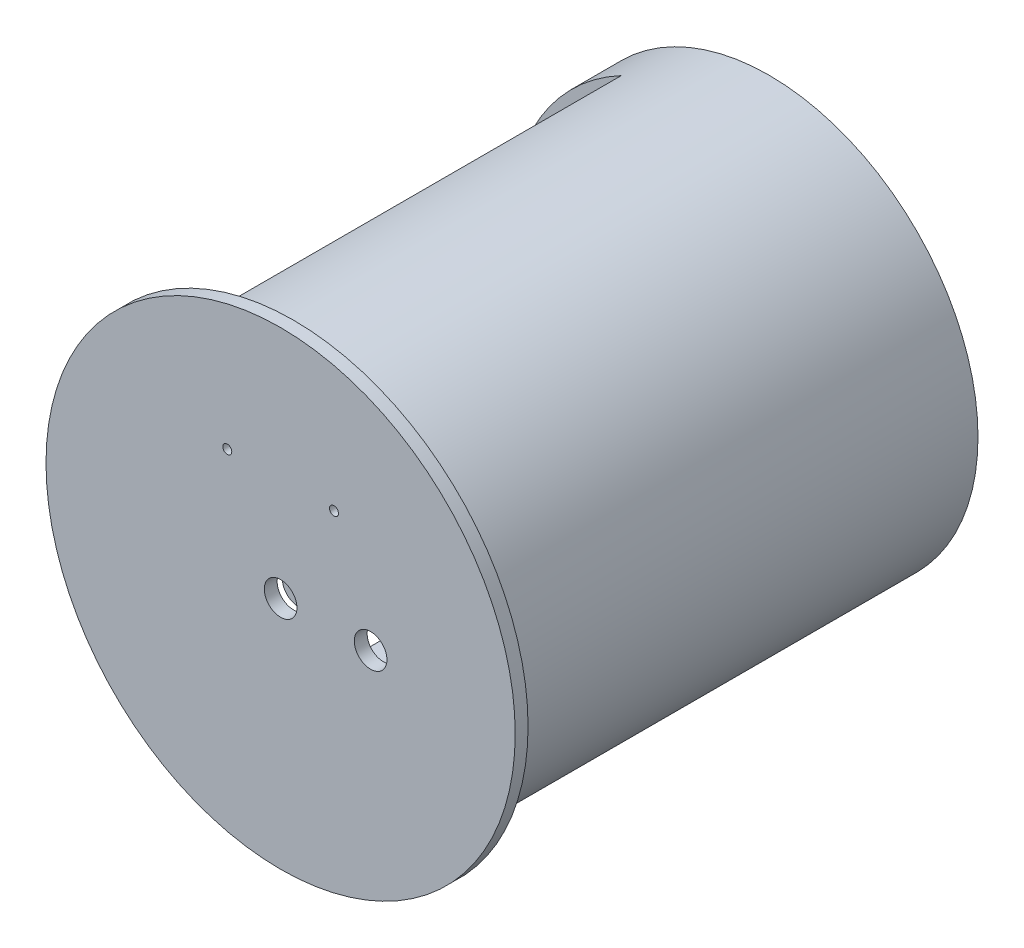
ISO-10303-21;
HEADER;
FILE_DESCRIPTION(('STEP AP214'),'2;1');
FILE_NAME('part.step','',(''),(''),'','','');
FILE_SCHEMA(('AUTOMOTIVE_DESIGN { 1 0 10303 214 1 1 1 1 }'));
ENDSEC;
DATA;
#1=APPLICATION_CONTEXT('core data for automotive mechanical design processes');
#2=APPLICATION_PROTOCOL_DEFINITION('international standard','automotive_design',2000,#1);
#3=PRODUCT_CONTEXT('',#1,'mechanical');
#4=PRODUCT('Part','Part','',(#3));
#5=PRODUCT_RELATED_PRODUCT_CATEGORY('part','',(#4));
#6=PRODUCT_DEFINITION_FORMATION('','',#4);
#7=PRODUCT_DEFINITION_CONTEXT('part definition',#1,'design');
#8=PRODUCT_DEFINITION('design','',#6,#7);
#9=PRODUCT_DEFINITION_SHAPE('','',#8);
#10=(LENGTH_UNIT() NAMED_UNIT(*) SI_UNIT(.MILLI.,.METRE.));
#11=(NAMED_UNIT(*) PLANE_ANGLE_UNIT() SI_UNIT($,.RADIAN.));
#12=(NAMED_UNIT(*) SI_UNIT($,.STERADIAN.) SOLID_ANGLE_UNIT());
#13=UNCERTAINTY_MEASURE_WITH_UNIT(LENGTH_MEASURE(1.E-05),#10,'distance_accuracy_value','');
#14=(GEOMETRIC_REPRESENTATION_CONTEXT(3) GLOBAL_UNCERTAINTY_ASSIGNED_CONTEXT((#13)) GLOBAL_UNIT_ASSIGNED_CONTEXT((#10,
#11,#12)) REPRESENTATION_CONTEXT('',''));
#15=CARTESIAN_POINT('',(0.,0.,0.));
#16=DIRECTION('',(0.,0.,1.));
#17=DIRECTION('',(1.,0.,0.));
#18=AXIS2_PLACEMENT_3D('',#15,#16,#17);
#19=CARTESIAN_POINT('',(0.,0.,432.));
#20=DIRECTION('',(0.,0.,-1.));
#21=DIRECTION('',(-1.,0.,0.));
#22=AXIS2_PLACEMENT_3D('',#19,#20,#21);
#23=CYLINDRICAL_SURFACE('',#22,132.);
#24=CARTESIAN_POINT('',(0.,0.,370.));
#25=DIRECTION('',(0.,0.,1.));
#26=DIRECTION('',(1.,0.,0.));
#27=AXIS2_PLACEMENT_3D('',#24,#25,#26);
#28=CIRCLE('',#27,132.);
#29=CARTESIAN_POINT('',(132.,0.,370.));
#30=VERTEX_POINT('',#29);
#31=EDGE_CURVE('E263',#30,#30,#28,.F.);
#32=ORIENTED_EDGE('',*,*,#31,.F.);
#33=EDGE_LOOP('',(#32));
#34=FACE_BOUND('',#33,.T.);
#35=CARTESIAN_POINT('',(0.,0.,15.));
#36=DIRECTION('',(0.,0.,1.));
#37=DIRECTION('',(1.,0.,0.));
#38=AXIS2_PLACEMENT_3D('',#35,#36,#37);
#39=CIRCLE('',#38,132.);
#40=CARTESIAN_POINT('',(132.,0.,15.));
#41=VERTEX_POINT('',#40);
#42=EDGE_CURVE('E260',#41,#41,#39,.T.);
#43=ORIENTED_EDGE('',*,*,#42,.F.);
#44=EDGE_LOOP('',(#43));
#45=FACE_BOUND('',#44,.T.);
#46=CARTESIAN_POINT('',(0.,0.,346.232558919201));
#47=DIRECTION('',(0.,0.,1.));
#48=DIRECTION('',(1.,0.,0.));
#49=AXIS2_PLACEMENT_3D('',#46,#47,#48);
#50=CIRCLE('',#49,132.);
#51=CARTESIAN_POINT('',(0.,132.,346.232558919201));
#52=VERTEX_POINT('',#51);
#53=CARTESIAN_POINT('',(0.,-132.,346.232558919201));
#54=VERTEX_POINT('',#53);
#55=EDGE_CURVE('E277',#52,#54,#50,.T.);
#56=ORIENTED_EDGE('',*,*,#55,.F.);
#57=DIRECTION('',(0.,0.,-1.));
#58=VECTOR('',#57,1.);
#59=CARTESIAN_POINT('',(0.,132.,432.));
#60=LINE('',#59,#58);
#61=CARTESIAN_POINT('',(0.,132.,38.7674410807994));
#62=VERTEX_POINT('',#61);
#63=EDGE_CURVE('E280',#52,#62,#60,.T.);
#64=ORIENTED_EDGE('',*,*,#63,.T.);
#65=CARTESIAN_POINT('',(0.,0.,38.7674410807994));
#66=DIRECTION('',(0.,0.,-1.));
#67=DIRECTION('',(-1.,0.,0.));
#68=AXIS2_PLACEMENT_3D('',#65,#66,#67);
#69=CIRCLE('',#68,132.);
#70=CARTESIAN_POINT('',(0.,-132.,38.7674410807994));
#71=VERTEX_POINT('',#70);
#72=EDGE_CURVE('E275',#71,#62,#69,.T.);
#73=ORIENTED_EDGE('',*,*,#72,.F.);
#74=DIRECTION('',(0.,0.,-1.));
#75=VECTOR('',#74,1.);
#76=CARTESIAN_POINT('',(0.,-132.,432.));
#77=LINE('',#76,#75);
#78=EDGE_CURVE('E267',#71,#54,#77,.F.);
#79=ORIENTED_EDGE('',*,*,#78,.T.);
#80=EDGE_LOOP('',(#56,#64,#73,#79));
#81=FACE_BOUND('',#80,.T.);
#82=ADVANCED_FACE('F35',(#34,#45,#81),#23,.F.);
#83=CARTESIAN_POINT('',(0.,0.,370.));
#84=DIRECTION('',(0.,0.,-1.));
#85=DIRECTION('',(-1.,0.,0.));
#86=AXIS2_PLACEMENT_3D('',#83,#84,#85);
#87=CYLINDRICAL_SURFACE('',#86,162.5);
#88=DIRECTION('',(0.,0.,-1.));
#89=VECTOR('',#88,1.);
#90=CARTESIAN_POINT('',(-76.1887947815311,143.532287481729,370.));
#91=LINE('',#90,#89);
#92=CARTESIAN_POINT('',(-76.1887947815311,143.532287481729,38.7674410807994));
#93=VERTEX_POINT('',#92);
#94=CARTESIAN_POINT('',(-76.1887947815312,143.532287481729,346.232558919201));
#95=VERTEX_POINT('',#94);
#96=EDGE_CURVE('E286',#93,#95,#91,.F.);
#97=ORIENTED_EDGE('',*,*,#96,.T.);
#98=CARTESIAN_POINT('',(0.,0.,346.232558919201));
#99=DIRECTION('',(0.,0.,1.));
#100=DIRECTION('',(1.,0.,0.));
#101=AXIS2_PLACEMENT_3D('',#98,#99,#100);
#102=CIRCLE('',#101,162.5);
#103=CARTESIAN_POINT('',(-76.1887947815312,-143.532287481729,346.232558919201));
#104=VERTEX_POINT('',#103);
#105=EDGE_CURVE('E257',#95,#104,#102,.T.);
#106=ORIENTED_EDGE('',*,*,#105,.T.);
#107=DIRECTION('',(0.,0.,-1.));
#108=VECTOR('',#107,1.);
#109=CARTESIAN_POINT('',(-76.1887947815311,-143.532287481729,370.));
#110=LINE('',#109,#108);
#111=CARTESIAN_POINT('',(-76.1887947815311,-143.532287481729,38.7674410807994));
#112=VERTEX_POINT('',#111);
#113=EDGE_CURVE('E283',#104,#112,#110,.T.);
#114=ORIENTED_EDGE('',*,*,#113,.T.);
#115=CARTESIAN_POINT('',(0.,0.,38.7674410807994));
#116=DIRECTION('',(0.,0.,-1.));
#117=DIRECTION('',(-1.,0.,0.));
#118=AXIS2_PLACEMENT_3D('',#115,#116,#117);
#119=CIRCLE('',#118,162.5);
#120=EDGE_CURVE('E250',#112,#93,#119,.T.);
#121=ORIENTED_EDGE('',*,*,#120,.T.);
#122=EDGE_LOOP('',(#97,#106,#114,#121));
#123=FACE_BOUND('',#122,.T.);
#124=CARTESIAN_POINT('',(0.,0.,370.));
#125=DIRECTION('',(0.,0.,1.));
#126=DIRECTION('',(1.,0.,0.));
#127=AXIS2_PLACEMENT_3D('',#124,#125,#126);
#128=CIRCLE('',#127,162.5);
#129=CARTESIAN_POINT('',(162.5,0.,370.));
#130=VERTEX_POINT('',#129);
#131=EDGE_CURVE('E264',#130,#130,#128,.T.);
#132=ORIENTED_EDGE('',*,*,#131,.F.);
#133=EDGE_LOOP('',(#132));
#134=FACE_BOUND('',#133,.T.);
#135=CARTESIAN_POINT('',(0.,0.,0.));
#136=DIRECTION('',(0.,0.,1.));
#137=DIRECTION('',(1.,0.,0.));
#138=AXIS2_PLACEMENT_3D('',#135,#136,#137);
#139=CIRCLE('',#138,162.5);
#140=CARTESIAN_POINT('',(162.5,0.,0.));
#141=VERTEX_POINT('',#140);
#142=EDGE_CURVE('E268',#141,#141,#139,.T.);
#143=ORIENTED_EDGE('',*,*,#142,.T.);
#144=EDGE_LOOP('',(#143));
#145=FACE_BOUND('',#144,.T.);
#146=ADVANCED_FACE('F37',(#123,#134,#145),#87,.T.);
#147=CARTESIAN_POINT('',(0.,0.,0.));
#148=DIRECTION('',(0.,0.,1.));
#149=DIRECTION('',(1.,0.,0.));
#150=AXIS2_PLACEMENT_3D('',#147,#148,#149);
#151=PLANE('',#150);
#152=ORIENTED_EDGE('',*,*,#142,.F.);
#153=EDGE_LOOP('',(#152));
#154=FACE_BOUND('',#153,.T.);
#155=ADVANCED_FACE('F337',(#154),#151,.F.);
#156=CARTESIAN_POINT('',(0.,0.,15.));
#157=DIRECTION('',(0.,0.,1.));
#158=DIRECTION('',(1.,0.,0.));
#159=AXIS2_PLACEMENT_3D('',#156,#157,#158);
#160=PLANE('',#159);
#161=CARTESIAN_POINT('',(0.,0.,15.));
#162=DIRECTION('',(0.,0.,1.));
#163=DIRECTION('',(1.,0.,0.));
#164=AXIS2_PLACEMENT_3D('',#161,#162,#163);
#165=CIRCLE('',#164,12.7);
#166=CARTESIAN_POINT('',(12.7,0.,15.));
#167=VERTEX_POINT('',#166);
#168=EDGE_CURVE('E188',#167,#167,#165,.T.);
#169=ORIENTED_EDGE('',*,*,#168,.F.);
#170=EDGE_LOOP('',(#169));
#171=FACE_BOUND('',#170,.T.);
#172=ORIENTED_EDGE('',*,*,#42,.T.);
#173=EDGE_LOOP('',(#172));
#174=FACE_BOUND('',#173,.T.);
#175=ADVANCED_FACE('F342',(#171,#174),#160,.T.);
#176=CARTESIAN_POINT('',(-417.,143.532287481729,38.7674410807994));
#177=DIRECTION('',(0.,1.,0.));
#178=DIRECTION('',(0.,0.,1.));
#179=AXIS2_PLACEMENT_3D('',#176,#177,#178);
#180=PLANE('',#179);
#181=DIRECTION('',(1.,0.,0.));
#182=VECTOR('',#181,1.);
#183=CARTESIAN_POINT('',(-417.,143.532287481729,38.7674410807994));
#184=LINE('',#183,#182);
#185=CARTESIAN_POINT('',(0.,143.532287481729,38.7674410807994));
#186=VERTEX_POINT('',#185);
#187=EDGE_CURVE('E251',#93,#186,#184,.T.);
#188=ORIENTED_EDGE('',*,*,#187,.T.);
#189=DIRECTION('',(0.,0.,1.));
#190=VECTOR('',#189,1.);
#191=CARTESIAN_POINT('',(0.,143.532287481729,38.7674410807994));
#192=LINE('',#191,#190);
#193=CARTESIAN_POINT('',(0.,143.532287481729,346.232558919201));
#194=VERTEX_POINT('',#193);
#195=EDGE_CURVE('E244',#186,#194,#192,.T.);
#196=ORIENTED_EDGE('',*,*,#195,.T.);
#197=DIRECTION('',(1.,0.,0.));
#198=VECTOR('',#197,1.);
#199=CARTESIAN_POINT('',(-417.,143.532287481729,346.232558919201));
#200=LINE('',#199,#198);
#201=EDGE_CURVE('E248',#95,#194,#200,.T.);
#202=ORIENTED_EDGE('',*,*,#201,.F.);
#203=ORIENTED_EDGE('',*,*,#96,.F.);
#204=EDGE_LOOP('',(#188,#196,#202,#203));
#205=FACE_BOUND('',#204,.T.);
#206=ADVANCED_FACE('F349',(#205),#180,.F.);
#207=CARTESIAN_POINT('',(-417.,-143.532287481729,38.7674410807994));
#208=DIRECTION('',(0.,-1.,0.));
#209=DIRECTION('',(0.,0.,-1.));
#210=AXIS2_PLACEMENT_3D('',#207,#208,#209);
#211=PLANE('',#210);
#212=DIRECTION('',(1.,0.,0.));
#213=VECTOR('',#212,1.);
#214=CARTESIAN_POINT('',(-417.,-143.532287481729,346.232558919201));
#215=LINE('',#214,#213);
#216=CARTESIAN_POINT('',(0.,-143.532287481729,346.232558919201));
#217=VERTEX_POINT('',#216);
#218=EDGE_CURVE('E247',#104,#217,#215,.T.);
#219=ORIENTED_EDGE('',*,*,#218,.T.);
#220=DIRECTION('',(0.,0.,-1.));
#221=VECTOR('',#220,1.);
#222=CARTESIAN_POINT('',(0.,-143.532287481729,38.7674410807994));
#223=LINE('',#222,#221);
#224=CARTESIAN_POINT('',(0.,-143.532287481729,38.7674410807994));
#225=VERTEX_POINT('',#224);
#226=EDGE_CURVE('E238',#217,#225,#223,.T.);
#227=ORIENTED_EDGE('',*,*,#226,.T.);
#228=DIRECTION('',(1.,0.,0.));
#229=VECTOR('',#228,1.);
#230=CARTESIAN_POINT('',(-417.,-143.532287481729,38.7674410807994));
#231=LINE('',#230,#229);
#232=EDGE_CURVE('E58',#112,#225,#231,.T.);
#233=ORIENTED_EDGE('',*,*,#232,.F.);
#234=ORIENTED_EDGE('',*,*,#113,.F.);
#235=EDGE_LOOP('',(#219,#227,#233,#234));
#236=FACE_BOUND('',#235,.T.);
#237=ADVANCED_FACE('F356',(#236),#211,.F.);
#238=CARTESIAN_POINT('',(-417.,143.532287481729,346.232558919201));
#239=DIRECTION('',(0.,0.,1.));
#240=DIRECTION('',(1.,0.,0.));
#241=AXIS2_PLACEMENT_3D('',#238,#239,#240);
#242=PLANE('',#241);
#243=ORIENTED_EDGE('',*,*,#201,.T.);
#244=DIRECTION('',(0.,-1.,0.));
#245=VECTOR('',#244,1.);
#246=CARTESIAN_POINT('',(0.,143.532287481729,346.232558919201));
#247=LINE('',#246,#245);
#248=EDGE_CURVE('E235',#194,#52,#247,.T.);
#249=ORIENTED_EDGE('',*,*,#248,.T.);
#250=ORIENTED_EDGE('',*,*,#55,.T.);
#251=EDGE_CURVE('E232',#54,#217,#247,.T.);
#252=ORIENTED_EDGE('',*,*,#251,.T.);
#253=ORIENTED_EDGE('',*,*,#218,.F.);
#254=ORIENTED_EDGE('',*,*,#105,.F.);
#255=EDGE_LOOP('',(#243,#249,#250,#252,#253,#254));
#256=FACE_BOUND('',#255,.T.);
#257=ADVANCED_FACE('F367',(#256),#242,.F.);
#258=CARTESIAN_POINT('',(-417.,143.532287481729,38.7674410807994));
#259=DIRECTION('',(0.,0.,-1.));
#260=DIRECTION('',(-1.,0.,0.));
#261=AXIS2_PLACEMENT_3D('',#258,#259,#260);
#262=PLANE('',#261);
#263=ORIENTED_EDGE('',*,*,#232,.T.);
#264=DIRECTION('',(0.,1.,0.));
#265=VECTOR('',#264,1.);
#266=CARTESIAN_POINT('',(0.,143.532287481729,38.7674410807994));
#267=LINE('',#266,#265);
#268=EDGE_CURVE('E241',#225,#71,#267,.T.);
#269=ORIENTED_EDGE('',*,*,#268,.T.);
#270=ORIENTED_EDGE('',*,*,#72,.T.);
#271=EDGE_CURVE('E240',#62,#186,#267,.T.);
#272=ORIENTED_EDGE('',*,*,#271,.T.);
#273=ORIENTED_EDGE('',*,*,#187,.F.);
#274=ORIENTED_EDGE('',*,*,#120,.F.);
#275=EDGE_LOOP('',(#263,#269,#270,#272,#273,#274));
#276=FACE_BOUND('',#275,.T.);
#277=ADVANCED_FACE('F379',(#276),#262,.F.);
#278=CARTESIAN_POINT('',(0.,0.,0.));
#279=DIRECTION('',(-1.,0.,0.));
#280=DIRECTION('',(0.,0.,1.));
#281=AXIS2_PLACEMENT_3D('',#278,#279,#280);
#282=PLANE('',#281);
#283=ORIENTED_EDGE('',*,*,#248,.F.);
#284=ORIENTED_EDGE('',*,*,#195,.F.);
#285=ORIENTED_EDGE('',*,*,#271,.F.);
#286=ORIENTED_EDGE('',*,*,#63,.F.);
#287=EDGE_LOOP('',(#283,#284,#285,#286));
#288=FACE_BOUND('',#287,.T.);
#289=ADVANCED_FACE('F374',(#288),#282,.T.);
#290=ORIENTED_EDGE('',*,*,#268,.F.);
#291=ORIENTED_EDGE('',*,*,#226,.F.);
#292=ORIENTED_EDGE('',*,*,#251,.F.);
#293=ORIENTED_EDGE('',*,*,#78,.F.);
#294=EDGE_LOOP('',(#290,#291,#292,#293));
#295=FACE_BOUND('',#294,.T.);
#296=ADVANCED_FACE('F382',(#295),#282,.T.);
#297=CARTESIAN_POINT('',(0.,0.,370.));
#298=DIRECTION('',(0.,0.,1.));
#299=DIRECTION('',(1.,0.,0.));
#300=AXIS2_PLACEMENT_3D('',#297,#298,#299);
#301=PLANE('',#300);
#302=CARTESIAN_POINT('',(0.,0.,370.));
#303=DIRECTION('',(0.,0.,1.));
#304=DIRECTION('',(1.,0.,0.));
#305=AXIS2_PLACEMENT_3D('',#302,#303,#304);
#306=CIRCLE('',#305,12.7);
#307=CARTESIAN_POINT('',(12.7,0.,370.));
#308=VERTEX_POINT('',#307);
#309=EDGE_CURVE('E220',#308,#308,#306,.T.);
#310=ORIENTED_EDGE('',*,*,#309,.T.);
#311=EDGE_LOOP('',(#310));
#312=FACE_BOUND('',#311,.T.);
#313=CARTESIAN_POINT('',(70.,0.,370.));
#314=DIRECTION('',(0.,0.,1.));
#315=DIRECTION('',(1.,0.,0.));
#316=AXIS2_PLACEMENT_3D('',#313,#314,#315);
#317=CIRCLE('',#316,12.7);
#318=CARTESIAN_POINT('',(82.7,0.,370.));
#319=VERTEX_POINT('',#318);
#320=EDGE_CURVE('E214',#319,#319,#317,.T.);
#321=ORIENTED_EDGE('',*,*,#320,.T.);
#322=EDGE_LOOP('',(#321));
#323=FACE_BOUND('',#322,.T.);
#324=CARTESIAN_POINT('',(-41.5,79.772762666072,370.));
#325=DIRECTION('',(0.,0.,1.));
#326=DIRECTION('',(1.,0.,0.));
#327=AXIS2_PLACEMENT_3D('',#324,#325,#326);
#328=CIRCLE('',#327,3.5);
#329=CARTESIAN_POINT('',(-38.,79.772762666072,370.));
#330=VERTEX_POINT('',#329);
#331=EDGE_CURVE('E208',#330,#330,#328,.T.);
#332=ORIENTED_EDGE('',*,*,#331,.T.);
#333=EDGE_LOOP('',(#332));
#334=FACE_BOUND('',#333,.T.);
#335=CARTESIAN_POINT('',(41.5,79.772762666072,370.));
#336=DIRECTION('',(0.,0.,1.));
#337=DIRECTION('',(1.,0.,0.));
#338=AXIS2_PLACEMENT_3D('',#335,#336,#337);
#339=CIRCLE('',#338,3.49999999999999);
#340=CARTESIAN_POINT('',(45.,79.772762666072,370.));
#341=VERTEX_POINT('',#340);
#342=EDGE_CURVE('E202',#341,#341,#339,.T.);
#343=ORIENTED_EDGE('',*,*,#342,.T.);
#344=EDGE_LOOP('',(#343));
#345=FACE_BOUND('',#344,.T.);
#346=ORIENTED_EDGE('',*,*,#31,.T.);
#347=EDGE_LOOP('',(#346));
#348=FACE_BOUND('',#347,.T.);
#349=ADVANCED_FACE('F392',(#312,#323,#334,#345,#348),#301,.F.);
#350=CARTESIAN_POINT('',(0.,0.,380.));
#351=DIRECTION('',(0.,0.,1.));
#352=DIRECTION('',(1.,0.,0.));
#353=AXIS2_PLACEMENT_3D('',#350,#351,#352);
#354=PLANE('',#353);
#355=CARTESIAN_POINT('',(-41.5,79.772762666072,380.));
#356=DIRECTION('',(0.,0.,1.));
#357=DIRECTION('',(1.,0.,0.));
#358=AXIS2_PLACEMENT_3D('',#355,#356,#357);
#359=CIRCLE('',#358,3.5);
#360=CARTESIAN_POINT('',(-38.,79.772762666072,380.));
#361=VERTEX_POINT('',#360);
#362=EDGE_CURVE('E211',#361,#361,#359,.T.);
#363=ORIENTED_EDGE('',*,*,#362,.F.);
#364=EDGE_LOOP('',(#363));
#365=FACE_BOUND('',#364,.T.);
#366=CARTESIAN_POINT('',(0.,0.,380.));
#367=DIRECTION('',(0.,0.,1.));
#368=DIRECTION('',(1.,0.,0.));
#369=AXIS2_PLACEMENT_3D('',#366,#367,#368);
#370=CIRCLE('',#369,12.7);
#371=CARTESIAN_POINT('',(12.7,0.,380.));
#372=VERTEX_POINT('',#371);
#373=EDGE_CURVE('E223',#372,#372,#370,.T.);
#374=ORIENTED_EDGE('',*,*,#373,.F.);
#375=EDGE_LOOP('',(#374));
#376=FACE_BOUND('',#375,.T.);
#377=CARTESIAN_POINT('',(0.,0.,380.));
#378=DIRECTION('',(0.,0.,1.));
#379=DIRECTION('',(1.,0.,0.));
#380=AXIS2_PLACEMENT_3D('',#377,#378,#379);
#381=CIRCLE('',#380,182.5);
#382=CARTESIAN_POINT('',(182.5,0.,380.));
#383=VERTEX_POINT('',#382);
#384=EDGE_CURVE('E229',#383,#383,#381,.T.);
#385=ORIENTED_EDGE('',*,*,#384,.T.);
#386=EDGE_LOOP('',(#385));
#387=FACE_BOUND('',#386,.T.);
#388=CARTESIAN_POINT('',(70.,0.,380.));
#389=DIRECTION('',(0.,0.,1.));
#390=DIRECTION('',(1.,0.,0.));
#391=AXIS2_PLACEMENT_3D('',#388,#389,#390);
#392=CIRCLE('',#391,12.7);
#393=CARTESIAN_POINT('',(82.7,0.,380.));
#394=VERTEX_POINT('',#393);
#395=EDGE_CURVE('E217',#394,#394,#392,.T.);
#396=ORIENTED_EDGE('',*,*,#395,.F.);
#397=EDGE_LOOP('',(#396));
#398=FACE_BOUND('',#397,.T.);
#399=CARTESIAN_POINT('',(41.5,79.772762666072,380.));
#400=DIRECTION('',(0.,0.,1.));
#401=DIRECTION('',(1.,0.,0.));
#402=AXIS2_PLACEMENT_3D('',#399,#400,#401);
#403=CIRCLE('',#402,3.49999999999999);
#404=CARTESIAN_POINT('',(45.,79.772762666072,380.));
#405=VERTEX_POINT('',#404);
#406=EDGE_CURVE('E205',#405,#405,#403,.T.);
#407=ORIENTED_EDGE('',*,*,#406,.F.);
#408=EDGE_LOOP('',(#407));
#409=FACE_BOUND('',#408,.T.);
#410=ADVANCED_FACE('F390',(#365,#376,#387,#398,#409),#354,.T.);
#411=ORIENTED_EDGE('',*,*,#131,.T.);
#412=EDGE_LOOP('',(#411));
#413=FACE_BOUND('',#412,.T.);
#414=CARTESIAN_POINT('',(0.,0.,370.));
#415=DIRECTION('',(0.,0.,1.));
#416=DIRECTION('',(1.,0.,0.));
#417=AXIS2_PLACEMENT_3D('',#414,#415,#416);
#418=CIRCLE('',#417,182.5);
#419=CARTESIAN_POINT('',(182.5,0.,370.));
#420=VERTEX_POINT('',#419);
#421=EDGE_CURVE('E226',#420,#420,#418,.T.);
#422=ORIENTED_EDGE('',*,*,#421,.F.);
#423=EDGE_LOOP('',(#422));
#424=FACE_BOUND('',#423,.T.);
#425=ADVANCED_FACE('F386',(#413,#424),#301,.F.);
#426=CARTESIAN_POINT('',(0.,0.,380.));
#427=DIRECTION('',(0.,0.,-1.));
#428=DIRECTION('',(-1.,0.,0.));
#429=AXIS2_PLACEMENT_3D('',#426,#427,#428);
#430=CYLINDRICAL_SURFACE('',#429,182.5);
#431=ORIENTED_EDGE('',*,*,#384,.F.);
#432=EDGE_LOOP('',(#431));
#433=FACE_BOUND('',#432,.T.);
#434=ORIENTED_EDGE('',*,*,#421,.T.);
#435=EDGE_LOOP('',(#434));
#436=FACE_BOUND('',#435,.T.);
#437=ADVANCED_FACE('F389',(#433,#436),#430,.T.);
#438=CARTESIAN_POINT('',(0.,0.,380.));
#439=DIRECTION('',(0.,0.,-1.));
#440=DIRECTION('',(-1.,0.,0.));
#441=AXIS2_PLACEMENT_3D('',#438,#439,#440);
#442=CYLINDRICAL_SURFACE('',#441,12.7);
#443=ORIENTED_EDGE('',*,*,#373,.T.);
#444=EDGE_LOOP('',(#443));
#445=FACE_BOUND('',#444,.T.);
#446=ORIENTED_EDGE('',*,*,#309,.F.);
#447=EDGE_LOOP('',(#446));
#448=FACE_BOUND('',#447,.T.);
#449=ADVANCED_FACE('F396',(#445,#448),#442,.F.);
#450=CARTESIAN_POINT('',(70.,0.,380.));
#451=DIRECTION('',(0.,0.,-1.));
#452=DIRECTION('',(-1.,0.,0.));
#453=AXIS2_PLACEMENT_3D('',#450,#451,#452);
#454=CYLINDRICAL_SURFACE('',#453,12.7);
#455=ORIENTED_EDGE('',*,*,#395,.T.);
#456=EDGE_LOOP('',(#455));
#457=FACE_BOUND('',#456,.T.);
#458=ORIENTED_EDGE('',*,*,#320,.F.);
#459=EDGE_LOOP('',(#458));
#460=FACE_BOUND('',#459,.T.);
#461=ADVANCED_FACE('F402',(#457,#460),#454,.F.);
#462=CARTESIAN_POINT('',(-41.5,79.772762666072,380.));
#463=DIRECTION('',(0.,0.,-1.));
#464=DIRECTION('',(-1.,0.,0.));
#465=AXIS2_PLACEMENT_3D('',#462,#463,#464);
#466=CYLINDRICAL_SURFACE('',#465,3.5);
#467=ORIENTED_EDGE('',*,*,#362,.T.);
#468=EDGE_LOOP('',(#467));
#469=FACE_BOUND('',#468,.T.);
#470=ORIENTED_EDGE('',*,*,#331,.F.);
#471=EDGE_LOOP('',(#470));
#472=FACE_BOUND('',#471,.T.);
#473=ADVANCED_FACE('F469',(#469,#472),#466,.F.);
#474=CARTESIAN_POINT('',(41.5,79.772762666072,380.));
#475=DIRECTION('',(0.,0.,-1.));
#476=DIRECTION('',(-1.,0.,0.));
#477=AXIS2_PLACEMENT_3D('',#474,#475,#476);
#478=CYLINDRICAL_SURFACE('',#477,3.49999999999999);
#479=ORIENTED_EDGE('',*,*,#406,.T.);
#480=EDGE_LOOP('',(#479));
#481=FACE_BOUND('',#480,.T.);
#482=ORIENTED_EDGE('',*,*,#342,.F.);
#483=EDGE_LOOP('',(#482));
#484=FACE_BOUND('',#483,.T.);
#485=ADVANCED_FACE('F329',(#481,#484),#478,.F.);
#486=CARTESIAN_POINT('',(0.,0.,366.));
#487=DIRECTION('',(0.,0.,-1.));
#488=DIRECTION('',(-1.,0.,0.));
#489=AXIS2_PLACEMENT_3D('',#486,#487,#488);
#490=CYLINDRICAL_SURFACE('',#489,12.7);
#491=CARTESIAN_POINT('',(-12.4129217074375,-2.6850278741621,195.328170247032));
#492=CARTESIAN_POINT('',(-12.338683658564,-3.02844712456657,195.328208936804));
#493=CARTESIAN_POINT('',(-12.2501135623257,-3.36873755345448,195.323748794497));
#494=CARTESIAN_POINT('',(-12.0452037242797,-4.04055108363597,195.30659703675));
#495=CARTESIAN_POINT('',(-11.9288709224467,-4.37207635302911,195.293907477097));
#496=CARTESIAN_POINT('',(-11.669542572199,-5.02339493066216,195.261094014658));
#497=CARTESIAN_POINT('',(-11.5265988957926,-5.34320963881573,195.240984501785));
#498=CARTESIAN_POINT('',(-11.2150103460394,-5.9695799857941,195.194325113735));
#499=CARTESIAN_POINT('',(-11.0463645007214,-6.27613512262258,195.167774994972));
#500=CARTESIAN_POINT('',(-10.6847610022641,-6.87370078606615,195.109385770283));
#501=CARTESIAN_POINT('',(-10.4918215504206,-7.16472272044226,195.077550618388));
#502=CARTESIAN_POINT('',(-10.0828128240023,-7.7297198802372,195.009804316604));
#503=CARTESIAN_POINT('',(-9.86673323797622,-8.00368741935715,194.97389134917));
#504=CARTESIAN_POINT('',(-9.41293196001165,-8.53277259664013,194.899312348015));
#505=CARTESIAN_POINT('',(-9.17520531894766,-8.78788589992021,194.860645685164));
#506=CARTESIAN_POINT('',(-8.6798099513027,-9.27750725150498,194.781949361325));
#507=CARTESIAN_POINT('',(-8.42214928479085,-9.51202354689338,194.741920254853));
#508=CARTESIAN_POINT('',(-7.88189657200034,-9.96458193475958,194.660882294493));
#509=CARTESIAN_POINT('',(-7.59884852303096,-10.1820799936463,194.619873451886));
#510=CARTESIAN_POINT('',(-7.01531077750253,-10.5925763919288,194.539322271844));
#511=CARTESIAN_POINT('',(-6.71482089818264,-10.7855744745388,194.499779949783));
#512=CARTESIAN_POINT('',(-6.09838498733238,-11.1457217693204,194.423573475963));
#513=CARTESIAN_POINT('',(-5.78243934783265,-11.312871636677,194.386909251263));
#514=CARTESIAN_POINT('',(-5.13721426628377,-11.6200994954628,194.317775256285));
#515=CARTESIAN_POINT('',(-4.80793500625489,-11.7601778563005,194.285305428774));
#516=CARTESIAN_POINT('',(-4.11786094239744,-12.0198692061876,194.223923813505));
#517=CARTESIAN_POINT('',(-3.75636850575425,-12.1377144567095,194.195349509845));
#518=CARTESIAN_POINT('',(-3.02381070214964,-12.340626375784,194.145438856973));
#519=CARTESIAN_POINT('',(-2.65274498003078,-12.4256918263741,194.124102776707));
#520=CARTESIAN_POINT('',(-1.90306263756161,-12.56239768753,194.089524618271));
#521=CARTESIAN_POINT('',(-1.52442885120295,-12.6139503643135,194.076303790186));
#522=CARTESIAN_POINT('',(-0.95408146856772,-12.6655530742639,194.063030329444));
#523=CARTESIAN_POINT('',(-0.76352353041754,-12.6784662686313,194.059698795024));
#524=CARTESIAN_POINT('',(-0.381986555154393,-12.6956900058775,194.055249756112));
#525=CARTESIAN_POINT('',(-0.191007502917554,-12.7000002345811,194.054132332478));
#526=CARTESIAN_POINT('',(0.,-12.7,194.054134835647));
#527=B_SPLINE_CURVE_WITH_KNOTS('',3,(#491,#492,#493,#494,#495,#496,#497,#498,#499,#500,#501,
#502,#503,#504,#505,#506,#507,#508,#509,#510,#511,#512,#513,#514,#515,#516,#517,#518,#519,#520,
#521,#522,#523,#524,#525,#526),.UNSPECIFIED.,.F.,.F.,(4,2,2,2,2,2,2,2,2,2,2,2,2,2,2,2,2,4),(0.,
1.0536809152668,2.10709871231592,3.15848420645623,4.20990947039682,5.26055161957821,
6.31166390791065,7.36301711635394,8.4139474231992,9.49061226360859,10.5672883876799,
11.643937216337,12.72057135237,13.8628262433224,15.0051235716738,16.1503994276838,
16.723292513752,17.296206521153),.UNSPECIFIED.);
#528=CARTESIAN_POINT('',(-12.4129217074375,-2.6850278741621,195.328170247032));
#529=VERTEX_POINT('',#528);
#530=CARTESIAN_POINT('',(0.,-12.7,194.054134835647));
#531=VERTEX_POINT('',#530);
#532=EDGE_CURVE('E712',#529,#531,#527,.T.);
#533=ORIENTED_EDGE('',*,*,#532,.T.);
#534=DIRECTION('',(0.,0.,-1.));
#535=VECTOR('',#534,1.);
#536=CARTESIAN_POINT('',(0.,-12.7,366.));
#537=LINE('',#536,#535);
#538=CARTESIAN_POINT('',(0.,-12.7,31.5853827936765));
#539=VERTEX_POINT('',#538);
#540=EDGE_CURVE('E11',#531,#539,#537,.T.);
#541=ORIENTED_EDGE('',*,*,#540,.T.);
#542=CARTESIAN_POINT('',(0.,0.,31.5853827936765));
#543=DIRECTION('',(0.,0.,-1.));
#544=DIRECTION('',(-1.,0.,0.));
#545=AXIS2_PLACEMENT_3D('',#542,#543,#544);
#546=CIRCLE('',#545,12.7);
#547=CARTESIAN_POINT('',(0.,12.7,31.5853827936765));
#548=VERTEX_POINT('',#547);
#549=EDGE_CURVE('E43',#539,#548,#546,.T.);
#550=ORIENTED_EDGE('',*,*,#549,.T.);
#551=DIRECTION('',(0.,0.,-1.));
#552=VECTOR('',#551,1.);
#553=CARTESIAN_POINT('',(0.,12.7,366.));
#554=LINE('',#553,#552);
#555=CARTESIAN_POINT('',(0.,12.7,194.054134835647));
#556=VERTEX_POINT('',#555);
#557=EDGE_CURVE('E289',#548,#556,#554,.F.);
#558=ORIENTED_EDGE('',*,*,#557,.T.);
#559=CARTESIAN_POINT('',(0.,12.7,194.054134835647));
#560=CARTESIAN_POINT('',(-0.351683633242866,12.7000446328983,194.054086282801));
#561=CARTESIAN_POINT('',(-0.703351842783863,12.6853939668204,194.05791103706));
#562=CARTESIAN_POINT('',(-1.40404709008565,12.627031240055,194.072953657541));
#563=CARTESIAN_POINT('',(-1.75307459810981,12.5833244831235,194.084170174506));
#564=CARTESIAN_POINT('',(-2.44536491686965,12.4672864025344,194.113615691068));
#565=CARTESIAN_POINT('',(-2.78863722936051,12.3950083874527,194.131831629307));
#566=CARTESIAN_POINT('',(-3.46766245341805,12.2224389676013,194.174608133293));
#567=CARTESIAN_POINT('',(-3.80341523291119,12.1221470712104,194.199168810383));
#568=CARTESIAN_POINT('',(-4.46493606637626,11.8943965354128,194.253755738383));
#569=CARTESIAN_POINT('',(-4.79070869178913,11.7669505534451,194.283779441843));
#570=CARTESIAN_POINT('',(-5.43041311219279,11.4857626021155,194.348266012542));
#571=CARTESIAN_POINT('',(-5.74433953072768,11.3320088639627,194.382730864821));
#572=CARTESIAN_POINT('',(-6.35823171517937,10.9993092620125,194.454909046374));
#573=CARTESIAN_POINT('',(-6.65819469525774,10.8203583995694,194.492623019634));
#574=CARTESIAN_POINT('',(-7.24207564376336,10.4385805325216,194.569988851096));
#575=CARTESIAN_POINT('',(-7.52600002224706,10.2357631678686,194.609639923122));
#576=CARTESIAN_POINT('',(-8.08187892435991,9.80305334303321,194.690374681031));
#577=CARTESIAN_POINT('',(-8.35346179784059,9.57268559308648,194.731471012099));
#578=CARTESIAN_POINT('',(-8.87639881378399,9.08989470289731,194.812820343623));
#579=CARTESIAN_POINT('',(-9.12775281474628,8.83747140840271,194.853073338177));
#580=CARTESIAN_POINT('',(-9.60853072559224,8.31221311046287,194.931266915957));
#581=CARTESIAN_POINT('',(-9.83795530298749,8.0393787287634,194.969207569555));
#582=CARTESIAN_POINT('',(-10.2732715040857,7.47508408224866,195.041345196802));
#583=CARTESIAN_POINT('',(-10.4791634236323,7.18362405165978,195.075542217514));
#584=CARTESIAN_POINT('',(-10.8781653841254,6.56501267477214,195.140836851558));
#585=CARTESIAN_POINT('',(-11.0696422096016,6.23676988976448,195.171601413871));
#586=CARTESIAN_POINT('',(-11.4226286378056,5.56398229507858,195.225858606848));
#587=CARTESIAN_POINT('',(-11.5841378155264,5.21943725428549,195.249351134381));
#588=CARTESIAN_POINT('',(-11.8761379048557,4.51583180893006,195.287806287238));
#589=CARTESIAN_POINT('',(-12.0065454831061,4.15673535792086,195.302746143139));
#590=CARTESIAN_POINT('',(-12.177542354293,3.6102580334384,195.317884561258));
#591=CARTESIAN_POINT('',(-12.2304495024544,3.42674449940805,195.321718857254));
#592=CARTESIAN_POINT('',(-12.3279477113304,3.05747683311864,195.326862729639));
#593=CARTESIAN_POINT('',(-12.3725383529245,2.8717225884382,195.328172178816));
#594=CARTESIAN_POINT('',(-12.4129217074375,2.68502787416211,195.328170247032));
#595=B_SPLINE_CURVE_WITH_KNOTS('',3,(#559,#560,#561,#562,#563,#564,#565,#566,#567,#568,#569,
#570,#571,#572,#573,#574,#575,#576,#577,#578,#579,#580,#581,#582,#583,#584,#585,#586,#587,#588,
#589,#590,#591,#592,#593,#594),.UNSPECIFIED.,.F.,.F.,(4,2,2,2,2,2,2,2,2,2,2,2,2,2,2,2,2,4),(0.,
1.05470145428449,2.10921044139408,3.16176113077095,4.21433029273645,5.26640988579722,
6.31896136374525,7.37172194349854,8.42405875146955,9.49827708982933,10.5725029416645,
11.6466960846278,12.7208757217583,13.8630270444373,15.0051945640939,16.1503888547202,
16.7232855233927,17.2962110561038),.UNSPECIFIED.);
#596=CARTESIAN_POINT('',(-12.4129217074375,2.6850278741621,195.328170247032));
#597=VERTEX_POINT('',#596);
#598=EDGE_CURVE('E292',#556,#597,#595,.T.);
#599=ORIENTED_EDGE('',*,*,#598,.T.);
#600=CARTESIAN_POINT('',(0.,0.,195.328170247032));
#601=DIRECTION('',(0.,0.,1.));
#602=DIRECTION('',(1.,0.,0.));
#603=AXIS2_PLACEMENT_3D('',#600,#601,#602);
#604=CIRCLE('',#603,12.7);
#605=EDGE_CURVE('E300',#597,#529,#604,.T.);
#606=ORIENTED_EDGE('',*,*,#605,.T.);
#607=EDGE_LOOP('',(#533,#541,#550,#558,#599,#606));
#608=FACE_BOUND('',#607,.T.);
#609=CARTESIAN_POINT('',(0.,0.,366.));
#610=DIRECTION('',(0.,0.,1.));
#611=DIRECTION('',(1.,0.,0.));
#612=AXIS2_PLACEMENT_3D('',#609,#610,#611);
#613=CIRCLE('',#612,12.7);
#614=CARTESIAN_POINT('',(12.7,0.,366.));
#615=VERTEX_POINT('',#614);
#616=EDGE_CURVE('E199',#615,#615,#613,.T.);
#617=ORIENTED_EDGE('',*,*,#616,.F.);
#618=EDGE_LOOP('',(#617));
#619=FACE_BOUND('',#618,.T.);
#620=ORIENTED_EDGE('',*,*,#168,.T.);
#621=EDGE_LOOP('',(#620));
#622=FACE_BOUND('',#621,.T.);
#623=ADVANCED_FACE('F302',(#608,#619,#622),#490,.T.);
#624=CARTESIAN_POINT('',(0.,0.,366.));
#625=DIRECTION('',(0.,0.,1.));
#626=DIRECTION('',(1.,0.,0.));
#627=AXIS2_PLACEMENT_3D('',#624,#625,#626);
#628=PLANE('',#627);
#629=ORIENTED_EDGE('',*,*,#616,.T.);
#630=EDGE_LOOP('',(#629));
#631=FACE_BOUND('',#630,.T.);
#632=ADVANCED_FACE('F321',(#631),#628,.T.);
#633=CARTESIAN_POINT('',(-84.,-2.68502787416239,155.328170247032));
#634=DIRECTION('',(1.,0.,0.));
#635=DIRECTION('',(0.,0.,-1.));
#636=AXIS2_PLACEMENT_3D('',#633,#634,#635);
#637=CYLINDRICAL_SURFACE('',#636,40.);
#638=ORIENTED_EDGE('',*,*,#532,.F.);
#639=DIRECTION('',(1.,0.,0.));
#640=VECTOR('',#639,1.);
#641=CARTESIAN_POINT('',(-84.,-2.6850278741621,195.328170247032));
#642=LINE('',#641,#640);
#643=CARTESIAN_POINT('',(-84.,-2.6850278741621,195.328170247032));
#644=VERTEX_POINT('',#643);
#645=EDGE_CURVE('E192',#644,#529,#642,.T.);
#646=ORIENTED_EDGE('',*,*,#645,.F.);
#647=CARTESIAN_POINT('',(-84.,-2.68502787416239,155.328170247032));
#648=DIRECTION('',(1.,0.,0.));
#649=DIRECTION('',(0.,0.,-1.));
#650=AXIS2_PLACEMENT_3D('',#647,#648,#649);
#651=CIRCLE('',#650,40.);
#652=CARTESIAN_POINT('',(-84.,-42.6850278741624,155.328170247032));
#653=VERTEX_POINT('',#652);
#654=EDGE_CURVE('E176',#644,#653,#651,.T.);
#655=ORIENTED_EDGE('',*,*,#654,.T.);
#656=DIRECTION('',(1.,0.,0.));
#657=VECTOR('',#656,1.);
#658=CARTESIAN_POINT('',(-84.,-42.6850278741624,155.328170247032));
#659=LINE('',#658,#657);
#660=CARTESIAN_POINT('',(0.,-42.6850278741624,155.328170247032));
#661=VERTEX_POINT('',#660);
#662=EDGE_CURVE('E189',#653,#661,#659,.T.);
#663=ORIENTED_EDGE('',*,*,#662,.T.);
#664=CARTESIAN_POINT('',(0.,-2.68502787416239,155.328170247032));
#665=DIRECTION('',(1.,0.,0.));
#666=DIRECTION('',(0.,0.,-1.));
#667=AXIS2_PLACEMENT_3D('',#664,#665,#666);
#668=CIRCLE('',#667,40.);
#669=EDGE_CURVE('E166',#531,#661,#668,.T.);
#670=ORIENTED_EDGE('',*,*,#669,.F.);
#671=EDGE_LOOP('',(#638,#646,#655,#663,#670));
#672=FACE_BOUND('',#671,.T.);
#673=ADVANCED_FACE('F312',(#672),#637,.T.);
#674=CARTESIAN_POINT('',(-84.,2.68502787416239,155.328170247032));
#675=DIRECTION('',(1.,0.,0.));
#676=DIRECTION('',(0.,0.,-1.));
#677=AXIS2_PLACEMENT_3D('',#674,#675,#676);
#678=CYLINDRICAL_SURFACE('',#677,40.);
#679=ORIENTED_EDGE('',*,*,#598,.F.);
#680=CARTESIAN_POINT('',(0.,2.68502787416239,155.328170247032));
#681=DIRECTION('',(1.,0.,0.));
#682=DIRECTION('',(0.,0.,1.));
#683=AXIS2_PLACEMENT_3D('',#680,#681,#682);
#684=CIRCLE('',#683,40.);
#685=CARTESIAN_POINT('',(0.,42.6850278741624,155.328170247032));
#686=VERTEX_POINT('',#685);
#687=EDGE_CURVE('E50',#686,#556,#684,.T.);
#688=ORIENTED_EDGE('',*,*,#687,.F.);
#689=DIRECTION('',(1.,0.,0.));
#690=VECTOR('',#689,1.);
#691=CARTESIAN_POINT('',(-84.,42.6850278741624,155.328170247032));
#692=LINE('',#691,#690);
#693=CARTESIAN_POINT('',(-84.,42.6850278741624,155.328170247032));
#694=VERTEX_POINT('',#693);
#695=EDGE_CURVE('E146',#694,#686,#692,.T.);
#696=ORIENTED_EDGE('',*,*,#695,.F.);
#697=CARTESIAN_POINT('',(-84.,2.68502787416239,155.328170247032));
#698=DIRECTION('',(1.,0.,0.));
#699=DIRECTION('',(0.,0.,1.));
#700=AXIS2_PLACEMENT_3D('',#697,#698,#699);
#701=CIRCLE('',#700,40.);
#702=CARTESIAN_POINT('',(-84.,2.6850278741621,195.328170247032));
#703=VERTEX_POINT('',#702);
#704=EDGE_CURVE('E158',#694,#703,#701,.T.);
#705=ORIENTED_EDGE('',*,*,#704,.T.);
#706=DIRECTION('',(1.,0.,0.));
#707=VECTOR('',#706,1.);
#708=CARTESIAN_POINT('',(-84.,2.6850278741621,195.328170247032));
#709=LINE('',#708,#707);
#710=EDGE_CURVE('E195',#703,#597,#709,.T.);
#711=ORIENTED_EDGE('',*,*,#710,.T.);
#712=EDGE_LOOP('',(#679,#688,#696,#705,#711));
#713=FACE_BOUND('',#712,.T.);
#714=ADVANCED_FACE('F306',(#713),#678,.T.);
#715=CARTESIAN_POINT('',(0.,-2.68502787416239,155.328170247032));
#716=DIRECTION('',(1.,0.,0.));
#717=DIRECTION('',(0.,0.,-1.));
#718=AXIS2_PLACEMENT_3D('',#715,#716,#717);
#719=PLANE('',#718);
#720=ORIENTED_EDGE('',*,*,#540,.F.);
#721=ORIENTED_EDGE('',*,*,#669,.T.);
#722=DIRECTION('',(0.,0.,-1.));
#723=VECTOR('',#722,1.);
#724=CARTESIAN_POINT('',(0.,-42.6850278741624,155.328170247032));
#725=LINE('',#724,#723);
#726=CARTESIAN_POINT('',(0.,-42.6850278741624,31.5853827936765));
#727=VERTEX_POINT('',#726);
#728=EDGE_CURVE('E163',#661,#727,#725,.T.);
#729=ORIENTED_EDGE('',*,*,#728,.T.);
#730=DIRECTION('',(0.,1.,0.));
#731=VECTOR('',#730,1.);
#732=CARTESIAN_POINT('',(0.,42.6850278741624,31.5853827936765));
#733=LINE('',#732,#731);
#734=EDGE_CURVE('E180',#727,#539,#733,.T.);
#735=ORIENTED_EDGE('',*,*,#734,.T.);
#736=EDGE_LOOP('',(#720,#721,#729,#735));
#737=FACE_BOUND('',#736,.T.);
#738=ADVANCED_FACE('F311',(#737),#719,.T.);
#739=ORIENTED_EDGE('',*,*,#557,.F.);
#740=CARTESIAN_POINT('',(0.,42.6850278741624,31.5853827936765));
#741=VERTEX_POINT('',#740);
#742=EDGE_CURVE('E183',#548,#741,#733,.T.);
#743=ORIENTED_EDGE('',*,*,#742,.T.);
#744=DIRECTION('',(0.,0.,1.));
#745=VECTOR('',#744,1.);
#746=CARTESIAN_POINT('',(0.,42.6850278741624,155.328170247032));
#747=LINE('',#746,#745);
#748=EDGE_CURVE('E142',#741,#686,#747,.T.);
#749=ORIENTED_EDGE('',*,*,#748,.T.);
#750=ORIENTED_EDGE('',*,*,#687,.T.);
#751=EDGE_LOOP('',(#739,#743,#749,#750));
#752=FACE_BOUND('',#751,.T.);
#753=ADVANCED_FACE('F320',(#752),#719,.T.);
#754=CARTESIAN_POINT('',(-84.,42.6850278741624,31.5853827936765));
#755=DIRECTION('',(0.,0.,-1.));
#756=DIRECTION('',(-1.,0.,0.));
#757=AXIS2_PLACEMENT_3D('',#754,#755,#756);
#758=PLANE('',#757);
#759=ORIENTED_EDGE('',*,*,#549,.F.);
#760=ORIENTED_EDGE('',*,*,#734,.F.);
#761=DIRECTION('',(1.,0.,0.));
#762=VECTOR('',#761,1.);
#763=CARTESIAN_POINT('',(-84.,-42.6850278741624,31.5853827936765));
#764=LINE('',#763,#762);
#765=CARTESIAN_POINT('',(-84.,-42.6850278741624,31.5853827936765));
#766=VERTEX_POINT('',#765);
#767=EDGE_CURVE('E162',#766,#727,#764,.T.);
#768=ORIENTED_EDGE('',*,*,#767,.F.);
#769=DIRECTION('',(0.,1.,0.));
#770=VECTOR('',#769,1.);
#771=CARTESIAN_POINT('',(-84.,42.6850278741624,31.5853827936765));
#772=LINE('',#771,#770);
#773=CARTESIAN_POINT('',(-84.,42.6850278741624,31.5853827936765));
#774=VERTEX_POINT('',#773);
#775=EDGE_CURVE('E154',#766,#774,#772,.T.);
#776=ORIENTED_EDGE('',*,*,#775,.T.);
#777=DIRECTION('',(1.,0.,0.));
#778=VECTOR('',#777,1.);
#779=CARTESIAN_POINT('',(-84.,42.6850278741624,31.5853827936765));
#780=LINE('',#779,#778);
#781=EDGE_CURVE('E138',#774,#741,#780,.T.);
#782=ORIENTED_EDGE('',*,*,#781,.T.);
#783=ORIENTED_EDGE('',*,*,#742,.F.);
#784=EDGE_LOOP('',(#759,#760,#768,#776,#782,#783));
#785=FACE_BOUND('',#784,.T.);
#786=ADVANCED_FACE('F160',(#785),#758,.T.);
#787=CARTESIAN_POINT('',(-84.,-42.6850278741624,155.328170247032));
#788=DIRECTION('',(0.,-1.,0.));
#789=DIRECTION('',(0.,0.,-1.));
#790=AXIS2_PLACEMENT_3D('',#787,#788,#789);
#791=PLANE('',#790);
#792=ORIENTED_EDGE('',*,*,#728,.F.);
#793=ORIENTED_EDGE('',*,*,#662,.F.);
#794=DIRECTION('',(0.,0.,-1.));
#795=VECTOR('',#794,1.);
#796=CARTESIAN_POINT('',(-84.,-42.6850278741624,155.328170247032));
#797=LINE('',#796,#795);
#798=EDGE_CURVE('E147',#653,#766,#797,.T.);
#799=ORIENTED_EDGE('',*,*,#798,.T.);
#800=ORIENTED_EDGE('',*,*,#767,.T.);
#801=EDGE_LOOP('',(#792,#793,#799,#800));
#802=FACE_BOUND('',#801,.T.);
#803=ADVANCED_FACE('F319',(#802),#791,.T.);
#804=CARTESIAN_POINT('',(-84.,2.6850278741621,195.328170247032));
#805=DIRECTION('',(0.,0.,1.));
#806=DIRECTION('',(1.,0.,0.));
#807=AXIS2_PLACEMENT_3D('',#804,#805,#806);
#808=PLANE('',#807);
#809=ORIENTED_EDGE('',*,*,#605,.F.);
#810=ORIENTED_EDGE('',*,*,#710,.F.);
#811=DIRECTION('',(0.,-1.,0.));
#812=VECTOR('',#811,1.);
#813=CARTESIAN_POINT('',(-84.,2.6850278741621,195.328170247032));
#814=LINE('',#813,#812);
#815=EDGE_CURVE('E173',#703,#644,#814,.T.);
#816=ORIENTED_EDGE('',*,*,#815,.T.);
#817=ORIENTED_EDGE('',*,*,#645,.T.);
#818=EDGE_LOOP('',(#809,#810,#816,#817));
#819=FACE_BOUND('',#818,.T.);
#820=ADVANCED_FACE('F314',(#819),#808,.T.);
#821=CARTESIAN_POINT('',(-84.,42.6850278741624,155.328170247032));
#822=DIRECTION('',(0.,1.,0.));
#823=DIRECTION('',(0.,0.,1.));
#824=AXIS2_PLACEMENT_3D('',#821,#822,#823);
#825=PLANE('',#824);
#826=ORIENTED_EDGE('',*,*,#748,.F.);
#827=ORIENTED_EDGE('',*,*,#781,.F.);
#828=DIRECTION('',(0.,0.,1.));
#829=VECTOR('',#828,1.);
#830=CARTESIAN_POINT('',(-84.,42.6850278741624,155.328170247032));
#831=LINE('',#830,#829);
#832=EDGE_CURVE('E141',#774,#694,#831,.T.);
#833=ORIENTED_EDGE('',*,*,#832,.T.);
#834=ORIENTED_EDGE('',*,*,#695,.T.);
#835=EDGE_LOOP('',(#826,#827,#833,#834));
#836=FACE_BOUND('',#835,.T.);
#837=ADVANCED_FACE('F140',(#836),#825,.T.);
#838=CARTESIAN_POINT('',(-84.,-2.68502787416239,155.328170247032));
#839=DIRECTION('',(1.,0.,0.));
#840=DIRECTION('',(0.,0.,-1.));
#841=AXIS2_PLACEMENT_3D('',#838,#839,#840);
#842=PLANE('',#841);
#843=CARTESIAN_POINT('',(-84.,26.7696781349267,99.615024167127));
#844=DIRECTION('',(1.,0.,0.));
#845=DIRECTION('',(0.,0.,-1.));
#846=AXIS2_PLACEMENT_3D('',#843,#844,#845);
#847=CIRCLE('',#846,8.18574153961588);
#848=CARTESIAN_POINT('',(-84.,26.7696781349267,91.4292826275111));
#849=VERTEX_POINT('',#848);
#850=EDGE_CURVE('E736',#849,#849,#847,.T.);
#851=ORIENTED_EDGE('',*,*,#850,.T.);
#852=EDGE_LOOP('',(#851));
#853=FACE_BOUND('',#852,.T.);
#854=CARTESIAN_POINT('',(-84.,-16.5724109717917,110.953177837437));
#855=DIRECTION('',(1.,0.,0.));
#856=DIRECTION('',(0.,0.,-1.));
#857=AXIS2_PLACEMENT_3D('',#854,#855,#856);
#858=CIRCLE('',#857,15.2732119481426);
#859=CARTESIAN_POINT('',(-84.,-16.5724109717917,95.679965889294));
#860=VERTEX_POINT('',#859);
#861=EDGE_CURVE('E728',#860,#860,#858,.T.);
#862=ORIENTED_EDGE('',*,*,#861,.T.);
#863=EDGE_LOOP('',(#862));
#864=FACE_BOUND('',#863,.T.);
#865=CARTESIAN_POINT('',(-84.,9.44161275955047,140.988957086484));
#866=DIRECTION('',(1.,0.,0.));
#867=DIRECTION('',(0.,0.,-1.));
#868=AXIS2_PLACEMENT_3D('',#865,#866,#867);
#869=CIRCLE('',#868,11.0394469217165);
#870=CARTESIAN_POINT('',(-84.,9.44161275955047,129.949510164767));
#871=VERTEX_POINT('',#870);
#872=EDGE_CURVE('E169',#871,#871,#869,.T.);
#873=ORIENTED_EDGE('',*,*,#872,.T.);
#874=EDGE_LOOP('',(#873));
#875=FACE_BOUND('',#874,.T.);
#876=ORIENTED_EDGE('',*,*,#775,.F.);
#877=ORIENTED_EDGE('',*,*,#798,.F.);
#878=ORIENTED_EDGE('',*,*,#654,.F.);
#879=ORIENTED_EDGE('',*,*,#815,.F.);
#880=ORIENTED_EDGE('',*,*,#704,.F.);
#881=ORIENTED_EDGE('',*,*,#832,.F.);
#882=EDGE_LOOP('',(#876,#877,#878,#879,#880,#881));
#883=FACE_BOUND('',#882,.T.);
#884=ADVANCED_FACE('F152',(#853,#864,#875,#883),#842,.F.);
#885=CARTESIAN_POINT('',(-113.,9.44161275955047,140.988957086484));
#886=DIRECTION('',(1.,0.,0.));
#887=DIRECTION('',(0.,0.,-1.));
#888=AXIS2_PLACEMENT_3D('',#885,#886,#887);
#889=CYLINDRICAL_SURFACE('',#888,11.0394469217165);
#890=CARTESIAN_POINT('',(-113.,9.44161275955047,140.988957086484));
#891=DIRECTION('',(1.,0.,0.));
#892=DIRECTION('',(0.,0.,-1.));
#893=AXIS2_PLACEMENT_3D('',#890,#891,#892);
#894=CIRCLE('',#893,11.0394469217165);
#895=CARTESIAN_POINT('',(-113.,9.44161275955047,129.949510164767));
#896=VERTEX_POINT('',#895);
#897=EDGE_CURVE('E724',#896,#896,#894,.T.);
#898=ORIENTED_EDGE('',*,*,#897,.T.);
#899=EDGE_LOOP('',(#898));
#900=FACE_BOUND('',#899,.T.);
#901=ORIENTED_EDGE('',*,*,#872,.F.);
#902=EDGE_LOOP('',(#901));
#903=FACE_BOUND('',#902,.T.);
#904=ADVANCED_FACE('F551',(#900,#903),#889,.T.);
#905=CARTESIAN_POINT('',(-113.,9.44161275955047,140.988957086484));
#906=DIRECTION('',(1.,0.,0.));
#907=DIRECTION('',(0.,0.,-1.));
#908=AXIS2_PLACEMENT_3D('',#905,#906,#907);
#909=PLANE('',#908);
#910=ORIENTED_EDGE('',*,*,#897,.F.);
#911=EDGE_LOOP('',(#910));
#912=FACE_BOUND('',#911,.T.);
#913=ADVANCED_FACE('F560',(#912),#909,.F.);
#914=CARTESIAN_POINT('',(-113.,-16.5724109717917,110.953177837437));
#915=DIRECTION('',(1.,0.,0.));
#916=DIRECTION('',(0.,0.,-1.));
#917=AXIS2_PLACEMENT_3D('',#914,#915,#916);
#918=CYLINDRICAL_SURFACE('',#917,15.2732119481426);
#919=CARTESIAN_POINT('',(-113.,-16.5724109717917,110.953177837437));
#920=DIRECTION('',(1.,0.,0.));
#921=DIRECTION('',(0.,0.,-1.));
#922=AXIS2_PLACEMENT_3D('',#919,#920,#921);
#923=CIRCLE('',#922,15.2732119481426);
#924=CARTESIAN_POINT('',(-113.,-16.5724109717917,95.679965889294));
#925=VERTEX_POINT('',#924);
#926=EDGE_CURVE('E731',#925,#925,#923,.T.);
#927=ORIENTED_EDGE('',*,*,#926,.T.);
#928=EDGE_LOOP('',(#927));
#929=FACE_BOUND('',#928,.T.);
#930=ORIENTED_EDGE('',*,*,#861,.F.);
#931=EDGE_LOOP('',(#930));
#932=FACE_BOUND('',#931,.T.);
#933=ADVANCED_FACE('F569',(#929,#932),#918,.T.);
#934=CARTESIAN_POINT('',(-113.,-16.5724109717917,110.953177837437));
#935=DIRECTION('',(1.,0.,0.));
#936=DIRECTION('',(0.,0.,-1.));
#937=AXIS2_PLACEMENT_3D('',#934,#935,#936);
#938=PLANE('',#937);
#939=ORIENTED_EDGE('',*,*,#926,.F.);
#940=EDGE_LOOP('',(#939));
#941=FACE_BOUND('',#940,.T.);
#942=ADVANCED_FACE('F579',(#941),#938,.F.);
#943=CARTESIAN_POINT('',(-113.,26.7696781349267,99.615024167127));
#944=DIRECTION('',(1.,0.,0.));
#945=DIRECTION('',(0.,0.,-1.));
#946=AXIS2_PLACEMENT_3D('',#943,#944,#945);
#947=CYLINDRICAL_SURFACE('',#946,8.18574153961588);
#948=CARTESIAN_POINT('',(-113.,26.7696781349267,99.615024167127));
#949=DIRECTION('',(1.,0.,0.));
#950=DIRECTION('',(0.,0.,-1.));
#951=AXIS2_PLACEMENT_3D('',#948,#949,#950);
#952=CIRCLE('',#951,8.18574153961588);
#953=CARTESIAN_POINT('',(-113.,26.7696781349267,91.4292826275111));
#954=VERTEX_POINT('',#953);
#955=EDGE_CURVE('E739',#954,#954,#952,.T.);
#956=ORIENTED_EDGE('',*,*,#955,.T.);
#957=EDGE_LOOP('',(#956));
#958=FACE_BOUND('',#957,.T.);
#959=ORIENTED_EDGE('',*,*,#850,.F.);
#960=EDGE_LOOP('',(#959));
#961=FACE_BOUND('',#960,.T.);
#962=ADVANCED_FACE('F589',(#958,#961),#947,.T.);
#963=CARTESIAN_POINT('',(-113.,26.7696781349267,99.615024167127));
#964=DIRECTION('',(1.,0.,0.));
#965=DIRECTION('',(0.,0.,-1.));
#966=AXIS2_PLACEMENT_3D('',#963,#964,#965);
#967=PLANE('',#966);
#968=ORIENTED_EDGE('',*,*,#955,.F.);
#969=EDGE_LOOP('',(#968));
#970=FACE_BOUND('',#969,.T.);
#971=ADVANCED_FACE('F599',(#970),#967,.F.);
#972=CLOSED_SHELL('',(#82,#146,#155,#175,#206,#237,#257,#277,#289,#296,#349,#410,#425,#437,#449,
#461,#473,#485,#623,#632,#673,#714,#738,#753,#786,#803,#820,#837,#884,#904,#913,#933,#942,#962,#971));
#973=MANIFOLD_SOLID_BREP('B2',#972);
#974=ADVANCED_BREP_SHAPE_REPRESENTATION('',(#18,#973),#14);
#975=SHAPE_DEFINITION_REPRESENTATION(#9,#974);
ENDSEC;
END-ISO-10303-21;
